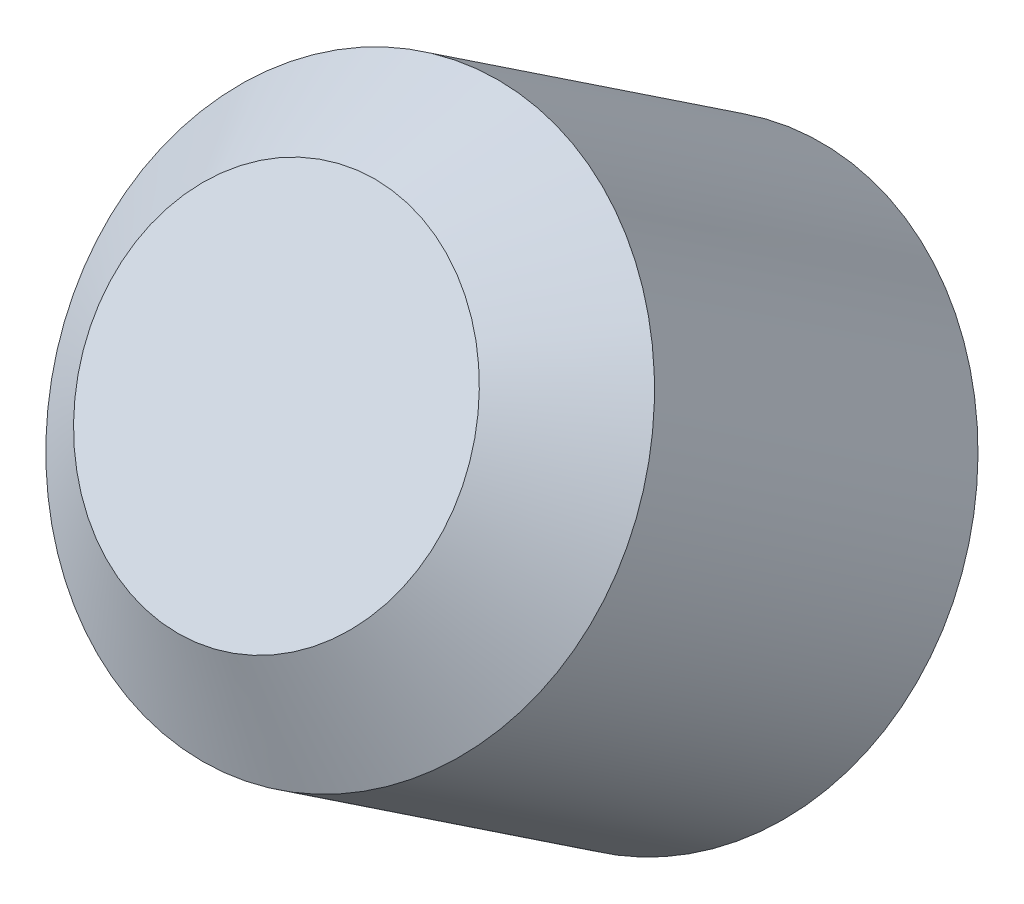
ISO-10303-21;
HEADER;
FILE_DESCRIPTION(('STEP AP214'),'2;1');
FILE_NAME('part.step','',(''),(''),'','','');
FILE_SCHEMA(('AUTOMOTIVE_DESIGN { 1 0 10303 214 1 1 1 1 }'));
ENDSEC;
DATA;
#1=APPLICATION_CONTEXT('core data for automotive mechanical design processes');
#2=APPLICATION_PROTOCOL_DEFINITION('international standard','automotive_design',2000,#1);
#3=PRODUCT_CONTEXT('',#1,'mechanical');
#4=PRODUCT('Part','Part','',(#3));
#5=PRODUCT_RELATED_PRODUCT_CATEGORY('part','',(#4));
#6=PRODUCT_DEFINITION_FORMATION('','',#4);
#7=PRODUCT_DEFINITION_CONTEXT('part definition',#1,'design');
#8=PRODUCT_DEFINITION('design','',#6,#7);
#9=PRODUCT_DEFINITION_SHAPE('','',#8);
#10=(LENGTH_UNIT() NAMED_UNIT(*) SI_UNIT(.MILLI.,.METRE.));
#11=(NAMED_UNIT(*) PLANE_ANGLE_UNIT() SI_UNIT($,.RADIAN.));
#12=(NAMED_UNIT(*) SI_UNIT($,.STERADIAN.) SOLID_ANGLE_UNIT());
#13=UNCERTAINTY_MEASURE_WITH_UNIT(LENGTH_MEASURE(1.E-05),#10,'distance_accuracy_value','');
#14=(GEOMETRIC_REPRESENTATION_CONTEXT(3) GLOBAL_UNCERTAINTY_ASSIGNED_CONTEXT((#13)) GLOBAL_UNIT_ASSIGNED_CONTEXT((#10,
#11,#12)) REPRESENTATION_CONTEXT('',''));
#15=CARTESIAN_POINT('',(0.,0.,0.));
#16=DIRECTION('',(0.,0.,1.));
#17=DIRECTION('',(1.,0.,0.));
#18=AXIS2_PLACEMENT_3D('',#15,#16,#17);
#19=CARTESIAN_POINT('',(0.,-2.38895200196565,-3.57531933287304));
#20=DIRECTION('',(0.,-0.555570233019603,-0.831469612302545));
#21=DIRECTION('',(0.,0.831469612302545,-0.555570233019603));
#22=AXIS2_PLACEMENT_3D('',#19,#20,#21);
#23=CONICAL_SURFACE('',#22,0.74999999988591,1.04719755105422);
#24=CARTESIAN_POINT('',(0.,-2.38895200199094,-3.57531933291089));
#25=DIRECTION('',(0.,-0.555570233019603,-0.831469612302545));
#26=DIRECTION('',(0.,0.831469612302545,-0.555570233019603));
#27=AXIS2_PLACEMENT_3D('',#24,#25,#26);
#28=CIRCLE('',#27,0.749999999964755);
#29=CARTESIAN_POINT('',(0.,-1.76534979277621,-3.99199700764673));
#30=VERTEX_POINT('',#29);
#31=CARTESIAN_POINT('',(-0.649519052823067,-2.07715089738149,-3.78365817028337));
#32=VERTEX_POINT('',#31);
#33=EDGE_CURVE('E141',#30,#32,#28,.F.);
#34=ORIENTED_EDGE('',*,*,#33,.F.);
#35=CARTESIAN_POINT('',(0.,-2.38895200199094,-3.57531933291089));
#36=DIRECTION('',(0.,-0.555570233019603,-0.831469612302545));
#37=DIRECTION('',(0.,0.831469612302545,-0.555570233019603));
#38=AXIS2_PLACEMENT_3D('',#35,#36,#37);
#39=CIRCLE('',#38,0.749999999964754);
#40=CARTESIAN_POINT('',(0.649519052823067,-2.07715089738149,-3.78365817028337));
#41=VERTEX_POINT('',#40);
#42=EDGE_CURVE('E144',#41,#30,#39,.F.);
#43=ORIENTED_EDGE('',*,*,#42,.F.);
#44=CARTESIAN_POINT('',(0.,-2.38895200199094,-3.57531933291089));
#45=DIRECTION('',(0.,-0.555570233019603,-0.831469612302545));
#46=DIRECTION('',(0.,0.831469612302545,-0.555570233019603));
#47=AXIS2_PLACEMENT_3D('',#44,#45,#46);
#48=CIRCLE('',#47,0.749999999964754);
#49=CARTESIAN_POINT('',(0.649519052823069,-2.70075310659374,-3.36698049552846));
#50=VERTEX_POINT('',#49);
#51=EDGE_CURVE('E94',#50,#41,#48,.F.);
#52=ORIENTED_EDGE('',*,*,#51,.F.);
#53=CARTESIAN_POINT('',(0.,-2.38895200199094,-3.57531933291089));
#54=DIRECTION('',(0.,-0.555570233019603,-0.831469612302545));
#55=DIRECTION('',(0.,0.831469612302545,-0.555570233019603));
#56=AXIS2_PLACEMENT_3D('',#53,#54,#55);
#57=CIRCLE('',#56,0.749999999964754);
#58=CARTESIAN_POINT('',(0.,-3.01255421114882,-3.15864165816794));
#59=VERTEX_POINT('',#58);
#60=EDGE_CURVE('E91',#59,#50,#57,.F.);
#61=ORIENTED_EDGE('',*,*,#60,.F.);
#62=CARTESIAN_POINT('',(0.,-2.38895200199094,-3.57531933291089));
#63=DIRECTION('',(0.,-0.555570233019603,-0.831469612302545));
#64=DIRECTION('',(0.,0.831469612302545,-0.555570233019603));
#65=AXIS2_PLACEMENT_3D('',#62,#63,#64);
#66=CIRCLE('',#65,0.749999999964754);
#67=CARTESIAN_POINT('',(-0.649519052823068,-2.70075310659374,-3.36698049552846));
#68=VERTEX_POINT('',#67);
#69=EDGE_CURVE('E20',#68,#59,#66,.F.);
#70=ORIENTED_EDGE('',*,*,#69,.F.);
#71=CARTESIAN_POINT('',(0.,-2.38895200199094,-3.57531933291089));
#72=DIRECTION('',(0.,-0.555570233019603,-0.831469612302545));
#73=DIRECTION('',(0.,0.831469612302545,-0.555570233019603));
#74=AXIS2_PLACEMENT_3D('',#71,#72,#73);
#75=CIRCLE('',#74,0.749999999964754);
#76=EDGE_CURVE('E139',#32,#68,#75,.F.);
#77=ORIENTED_EDGE('',*,*,#76,.F.);
#78=EDGE_LOOP('',(#34,#43,#52,#61,#70,#77));
#79=FACE_BOUND('',#78,.T.);
#80=CARTESIAN_POINT('',(0.,-2.1483830343243,-3.21528242950819));
#81=VERTEX_POINT('',#80);
#82=VERTEX_LOOP('',#81);
#83=FACE_BOUND('',#82,.T.);
#84=ADVANCED_FACE('F17',(#79,#83),#23,.F.);
#85=CARTESIAN_POINT('',(0.,-2.38895200198429,-3.57531933290094));
#86=DIRECTION('',(0.,-0.555570233019602,-0.831469612302545));
#87=DIRECTION('',(0.,0.831469612302545,-0.555570233019602));
#88=AXIS2_PLACEMENT_3D('',#85,#86,#87);
#89=PLANE('',#88);
#90=DIRECTION('',(1.,0.,0.));
#91=VECTOR('',#90,1.);
#92=CARTESIAN_POINT('',(0.433012701892219,-3.0125542112112,-3.15864165813624));
#93=LINE('',#92,#91);
#94=CARTESIAN_POINT('',(-0.433012701892219,-3.0125542112112,-3.15864165813624));
#95=VERTEX_POINT('',#94);
#96=EDGE_CURVE('E102',#59,#95,#93,.F.);
#97=ORIENTED_EDGE('',*,*,#96,.T.);
#98=DIRECTION('',(-0.499999999999999,0.720073806728807,-0.481137935381409));
#99=VECTOR('',#98,1.);
#100=CARTESIAN_POINT('',(-0.433012701892216,-3.0125542112112,-3.15864165813624));
#101=LINE('',#100,#99);
#102=EDGE_CURVE('E104',#95,#68,#101,.T.);
#103=ORIENTED_EDGE('',*,*,#102,.T.);
#104=ORIENTED_EDGE('',*,*,#69,.T.);
#105=EDGE_LOOP('',(#97,#103,#104));
#106=FACE_BOUND('',#105,.T.);
#107=ADVANCED_FACE('F100',(#106),#89,.T.);
#108=CARTESIAN_POINT('',(0.,-2.38895200198429,-3.57531933290094));
#109=DIRECTION('',(0.,-0.555570233019602,-0.831469612302545));
#110=DIRECTION('',(0.,0.831469612302545,-0.555570233019602));
#111=AXIS2_PLACEMENT_3D('',#108,#109,#110);
#112=PLANE('',#111);
#113=DIRECTION('',(-0.499999999999999,-0.720073806728807,0.48113793538141));
#114=VECTOR('',#113,1.);
#115=CARTESIAN_POINT('',(0.649519052838329,-2.70075310659774,-3.36698049551859));
#116=LINE('',#115,#114);
#117=CARTESIAN_POINT('',(0.433012701892218,-3.0125542112112,-3.15864165813624));
#118=VERTEX_POINT('',#117);
#119=EDGE_CURVE('E110',#50,#118,#116,.T.);
#120=ORIENTED_EDGE('',*,*,#119,.T.);
#121=DIRECTION('',(1.,0.,0.));
#122=VECTOR('',#121,1.);
#123=CARTESIAN_POINT('',(0.433012701892219,-3.0125542112112,-3.15864165813624));
#124=LINE('',#123,#122);
#125=EDGE_CURVE('E107',#118,#59,#124,.F.);
#126=ORIENTED_EDGE('',*,*,#125,.T.);
#127=ORIENTED_EDGE('',*,*,#60,.T.);
#128=EDGE_LOOP('',(#120,#126,#127));
#129=FACE_BOUND('',#128,.T.);
#130=ADVANCED_FACE('F108',(#129),#112,.T.);
#131=CARTESIAN_POINT('',(0.,-2.38895200198429,-3.57531933290094));
#132=DIRECTION('',(0.,-0.555570233019602,-0.831469612302545));
#133=DIRECTION('',(0.,0.831469612302545,-0.555570233019602));
#134=AXIS2_PLACEMENT_3D('',#131,#132,#133);
#135=PLANE('',#134);
#136=DIRECTION('',(0.5,-0.72007380672879,0.481137935381434));
#137=VECTOR('',#136,1.);
#138=CARTESIAN_POINT('',(0.64951905283833,-2.07715089737084,-3.7836581702833));
#139=LINE('',#138,#137);
#140=CARTESIAN_POINT('',(0.866025403784439,-2.38895200198429,-3.57531933290094));
#141=VERTEX_POINT('',#140);
#142=EDGE_CURVE('E151',#41,#141,#139,.T.);
#143=ORIENTED_EDGE('',*,*,#142,.T.);
#144=DIRECTION('',(-0.499999999999999,-0.720073806728801,0.481137935381418));
#145=VECTOR('',#144,1.);
#146=CARTESIAN_POINT('',(0.866025403784437,-2.38895200198429,-3.57531933290094));
#147=LINE('',#146,#145);
#148=EDGE_CURVE('E153',#141,#50,#147,.T.);
#149=ORIENTED_EDGE('',*,*,#148,.T.);
#150=ORIENTED_EDGE('',*,*,#51,.T.);
#151=EDGE_LOOP('',(#143,#149,#150));
#152=FACE_BOUND('',#151,.T.);
#153=ADVANCED_FACE('F149',(#152),#135,.T.);
#154=CARTESIAN_POINT('',(0.,-2.38895200198429,-3.57531933290094));
#155=DIRECTION('',(0.,-0.555570233019602,-0.831469612302545));
#156=DIRECTION('',(0.,0.831469612302545,-0.555570233019602));
#157=AXIS2_PLACEMENT_3D('',#154,#155,#156);
#158=PLANE('',#157);
#159=DIRECTION('',(1.,0.,0.));
#160=VECTOR('',#159,1.);
#161=CARTESIAN_POINT('',(-0.433012701892219,-1.76534979275738,-3.99199700766565));
#162=LINE('',#161,#160);
#163=CARTESIAN_POINT('',(0.433012701892219,-1.76534979275738,-3.99199700766565));
#164=VERTEX_POINT('',#163);
#165=EDGE_CURVE('E160',#30,#164,#162,.T.);
#166=ORIENTED_EDGE('',*,*,#165,.T.);
#167=DIRECTION('',(0.499999999999999,-0.720073806728807,0.481137935381409));
#168=VECTOR('',#167,1.);
#169=CARTESIAN_POINT('',(0.433012701892219,-1.76534979275738,-3.99199700766565));
#170=LINE('',#169,#168);
#171=EDGE_CURVE('E156',#164,#41,#170,.T.);
#172=ORIENTED_EDGE('',*,*,#171,.T.);
#173=ORIENTED_EDGE('',*,*,#42,.T.);
#174=EDGE_LOOP('',(#166,#172,#173));
#175=FACE_BOUND('',#174,.T.);
#176=ADVANCED_FACE('F157',(#175),#158,.T.);
#177=CARTESIAN_POINT('',(0.,-2.38895200198429,-3.57531933290094));
#178=DIRECTION('',(0.,-0.555570233019602,-0.831469612302545));
#179=DIRECTION('',(0.,0.831469612302545,-0.555570233019602));
#180=AXIS2_PLACEMENT_3D('',#177,#178,#179);
#181=PLANE('',#180);
#182=DIRECTION('',(0.499999999999999,0.720073806728808,-0.481137935381407));
#183=VECTOR('',#182,1.);
#184=CARTESIAN_POINT('',(-0.649519052838331,-2.07715089737084,-3.7836581702833));
#185=LINE('',#184,#183);
#186=CARTESIAN_POINT('',(-0.43301270189222,-1.76534979275738,-3.99199700766565));
#187=VERTEX_POINT('',#186);
#188=EDGE_CURVE('E209',#32,#187,#185,.T.);
#189=ORIENTED_EDGE('',*,*,#188,.T.);
#190=DIRECTION('',(1.,0.,0.));
#191=VECTOR('',#190,1.);
#192=CARTESIAN_POINT('',(-0.433012701892219,-1.76534979275738,-3.99199700766565));
#193=LINE('',#192,#191);
#194=EDGE_CURVE('E211',#187,#30,#193,.T.);
#195=ORIENTED_EDGE('',*,*,#194,.T.);
#196=ORIENTED_EDGE('',*,*,#33,.T.);
#197=EDGE_LOOP('',(#189,#195,#196));
#198=FACE_BOUND('',#197,.T.);
#199=ADVANCED_FACE('F255',(#198),#181,.T.);
#200=CARTESIAN_POINT('',(0.,-2.38895200198429,-3.57531933290094));
#201=DIRECTION('',(0.,-0.555570233019602,-0.831469612302545));
#202=DIRECTION('',(0.,0.831469612302545,-0.555570233019602));
#203=AXIS2_PLACEMENT_3D('',#200,#201,#202);
#204=PLANE('',#203);
#205=DIRECTION('',(-0.499999999999999,0.7200738067288,-0.481137935381419));
#206=VECTOR('',#205,1.);
#207=CARTESIAN_POINT('',(-0.649519052838327,-2.70075310659774,-3.36698049551859));
#208=LINE('',#207,#206);
#209=CARTESIAN_POINT('',(-0.866025403784439,-2.38895200198429,-3.57531933290094));
#210=VERTEX_POINT('',#209);
#211=EDGE_CURVE('E120',#68,#210,#208,.T.);
#212=ORIENTED_EDGE('',*,*,#211,.T.);
#213=DIRECTION('',(0.499999999999999,0.720073806728789,-0.481137935381436));
#214=VECTOR('',#213,1.);
#215=CARTESIAN_POINT('',(-0.866025403784441,-2.38895200198429,-3.57531933290094));
#216=LINE('',#215,#214);
#217=EDGE_CURVE('E203',#210,#32,#216,.T.);
#218=ORIENTED_EDGE('',*,*,#217,.T.);
#219=ORIENTED_EDGE('',*,*,#76,.T.);
#220=EDGE_LOOP('',(#212,#218,#219));
#221=FACE_BOUND('',#220,.T.);
#222=ADVANCED_FACE('F253',(#221),#204,.T.);
#223=CARTESIAN_POINT('',(-0.433012701892219,-3.67923849083472,-4.1564051928993));
#224=DIRECTION('',(-0.866025403784439,-0.415734806151272,0.277785116509801));
#225=DIRECTION('',(0.43276711903251,-0.901505751886421,0.));
#226=AXIS2_PLACEMENT_3D('',#223,#224,#225);
#227=PLANE('',#226);
#228=DIRECTION('',(0.,-0.555570233019602,-0.831469612302545));
#229=VECTOR('',#228,1.);
#230=CARTESIAN_POINT('',(-0.433012701892219,-3.67923849083472,-4.1564051928993));
#231=LINE('',#230,#229);
#232=CARTESIAN_POINT('',(-0.433012701892219,-3.67923849083472,-4.1564051928993));
#233=VERTEX_POINT('',#232);
#234=EDGE_CURVE('E113',#95,#233,#231,.T.);
#235=ORIENTED_EDGE('',*,*,#234,.T.);
#236=DIRECTION('',(0.500000000000001,-0.720073806728802,0.481137935381416));
#237=VECTOR('',#236,1.);
#238=CARTESIAN_POINT('',(-0.866025403784439,-3.05563628160781,-4.573082867664));
#239=LINE('',#238,#237);
#240=CARTESIAN_POINT('',(-0.866025403784439,-3.05563628160781,-4.573082867664));
#241=VERTEX_POINT('',#240);
#242=EDGE_CURVE('E201',#241,#233,#239,.T.);
#243=ORIENTED_EDGE('',*,*,#242,.F.);
#244=DIRECTION('',(0.,0.5555702330196,0.831469612302547));
#245=VECTOR('',#244,1.);
#246=CARTESIAN_POINT('',(-0.866025403784439,-3.05563628160781,-4.573082867664));
#247=LINE('',#246,#245);
#248=EDGE_CURVE('E216',#241,#210,#247,.T.);
#249=ORIENTED_EDGE('',*,*,#248,.T.);
#250=ORIENTED_EDGE('',*,*,#211,.F.);
#251=ORIENTED_EDGE('',*,*,#102,.F.);
#252=EDGE_LOOP('',(#235,#243,#249,#250,#251));
#253=FACE_BOUND('',#252,.T.);
#254=ADVANCED_FACE('F251',(#253),#227,.F.);
#255=CARTESIAN_POINT('',(0.433012701892219,-3.67923849083472,-4.1564051928993));
#256=DIRECTION('',(0.,-0.831469612302545,0.555570233019602));
#257=DIRECTION('',(0.,-0.555570233019602,-0.831469612302545));
#258=AXIS2_PLACEMENT_3D('',#255,#256,#257);
#259=PLANE('',#258);
#260=DIRECTION('',(0.,-0.555570233019599,-0.831469612302547));
#261=VECTOR('',#260,1.);
#262=CARTESIAN_POINT('',(0.433012701892218,-3.0125542112112,-3.15864165813624));
#263=LINE('',#262,#261);
#264=CARTESIAN_POINT('',(0.433012701892219,-3.67923849083472,-4.1564051928993));
#265=VERTEX_POINT('',#264);
#266=EDGE_CURVE('E170',#118,#265,#263,.T.);
#267=ORIENTED_EDGE('',*,*,#266,.T.);
#268=DIRECTION('',(1.,0.,0.));
#269=VECTOR('',#268,1.);
#270=CARTESIAN_POINT('',(0.,-3.67923849083472,-4.1564051928993));
#271=LINE('',#270,#269);
#272=EDGE_CURVE('E188',#233,#265,#271,.T.);
#273=ORIENTED_EDGE('',*,*,#272,.F.);
#274=ORIENTED_EDGE('',*,*,#234,.F.);
#275=ORIENTED_EDGE('',*,*,#96,.F.);
#276=ORIENTED_EDGE('',*,*,#125,.F.);
#277=EDGE_LOOP('',(#267,#273,#274,#275,#276));
#278=FACE_BOUND('',#277,.T.);
#279=ADVANCED_FACE('F116',(#278),#259,.F.);
#280=CARTESIAN_POINT('',(0.866025403784439,-3.05563628160781,-4.573082867664));
#281=DIRECTION('',(0.866025403784439,-0.415734806151272,0.277785116509801));
#282=DIRECTION('',(0.43276711903251,0.901505751886421,0.));
#283=AXIS2_PLACEMENT_3D('',#280,#281,#282);
#284=PLANE('',#283);
#285=DIRECTION('',(0.,-0.5555702330196,-0.831469612302547));
#286=VECTOR('',#285,1.);
#287=CARTESIAN_POINT('',(0.86602540378444,-2.38895200198429,-3.57531933290094));
#288=LINE('',#287,#286);
#289=CARTESIAN_POINT('',(0.866025403784439,-3.05563628160781,-4.573082867664));
#290=VERTEX_POINT('',#289);
#291=EDGE_CURVE('E163',#141,#290,#288,.T.);
#292=ORIENTED_EDGE('',*,*,#291,.T.);
#293=DIRECTION('',(0.500000000000001,0.720073806728802,-0.481137935381416));
#294=VECTOR('',#293,1.);
#295=CARTESIAN_POINT('',(0.433012701892219,-3.67923849083472,-4.1564051928993));
#296=LINE('',#295,#294);
#297=EDGE_CURVE('E192',#265,#290,#296,.T.);
#298=ORIENTED_EDGE('',*,*,#297,.F.);
#299=ORIENTED_EDGE('',*,*,#266,.F.);
#300=ORIENTED_EDGE('',*,*,#119,.F.);
#301=ORIENTED_EDGE('',*,*,#148,.F.);
#302=EDGE_LOOP('',(#292,#298,#299,#300,#301));
#303=FACE_BOUND('',#302,.T.);
#304=ADVANCED_FACE('F193',(#303),#284,.F.);
#305=CARTESIAN_POINT('',(0.433012701892219,-2.4320340723809,-4.9897605424287));
#306=DIRECTION('',(0.866025403784439,0.415734806151272,-0.277785116509801));
#307=DIRECTION('',(-0.43276711903251,0.901505751886421,0.));
#308=AXIS2_PLACEMENT_3D('',#305,#306,#307);
#309=PLANE('',#308);
#310=DIRECTION('',(0.,0.555570233019602,0.831469612302545));
#311=VECTOR('',#310,1.);
#312=CARTESIAN_POINT('',(0.433012701892219,-2.4320340723809,-4.9897605424287));
#313=LINE('',#312,#311);
#314=CARTESIAN_POINT('',(0.433012701892219,-2.4320340723809,-4.9897605424287));
#315=VERTEX_POINT('',#314);
#316=EDGE_CURVE('E233',#164,#315,#313,.F.);
#317=ORIENTED_EDGE('',*,*,#316,.T.);
#318=DIRECTION('',(-0.500000000000001,0.720073806728802,-0.481137935381415));
#319=VECTOR('',#318,1.);
#320=CARTESIAN_POINT('',(0.866025403784439,-3.05563628160781,-4.573082867664));
#321=LINE('',#320,#319);
#322=EDGE_CURVE('E196',#290,#315,#321,.T.);
#323=ORIENTED_EDGE('',*,*,#322,.F.);
#324=ORIENTED_EDGE('',*,*,#291,.F.);
#325=ORIENTED_EDGE('',*,*,#142,.F.);
#326=ORIENTED_EDGE('',*,*,#171,.F.);
#327=EDGE_LOOP('',(#317,#323,#324,#325,#326));
#328=FACE_BOUND('',#327,.T.);
#329=ADVANCED_FACE('F166',(#328),#309,.F.);
#330=CARTESIAN_POINT('',(-0.433012701892219,-2.4320340723809,-4.9897605424287));
#331=DIRECTION('',(0.,0.831469612302545,-0.555570233019602));
#332=DIRECTION('',(0.,0.555570233019602,0.831469612302545));
#333=AXIS2_PLACEMENT_3D('',#330,#331,#332);
#334=PLANE('',#333);
#335=DIRECTION('',(0.,-0.555570233019603,-0.831469612302545));
#336=VECTOR('',#335,1.);
#337=CARTESIAN_POINT('',(-0.43301270189222,-1.76534979275738,-3.99199700766565));
#338=LINE('',#337,#336);
#339=CARTESIAN_POINT('',(-0.433012701892219,-2.4320340723809,-4.9897605424287));
#340=VERTEX_POINT('',#339);
#341=EDGE_CURVE('E35',#187,#340,#338,.T.);
#342=ORIENTED_EDGE('',*,*,#341,.T.);
#343=DIRECTION('',(1.,0.,0.));
#344=VECTOR('',#343,1.);
#345=CARTESIAN_POINT('',(0.,-2.4320340723809,-4.9897605424287));
#346=LINE('',#345,#344);
#347=EDGE_CURVE('E229',#315,#340,#346,.F.);
#348=ORIENTED_EDGE('',*,*,#347,.F.);
#349=ORIENTED_EDGE('',*,*,#316,.F.);
#350=ORIENTED_EDGE('',*,*,#165,.F.);
#351=ORIENTED_EDGE('',*,*,#194,.F.);
#352=EDGE_LOOP('',(#342,#348,#349,#350,#351));
#353=FACE_BOUND('',#352,.T.);
#354=ADVANCED_FACE('F243',(#353),#334,.F.);
#355=CARTESIAN_POINT('',(-0.866025403784439,-3.05563628160781,-4.573082867664));
#356=DIRECTION('',(-0.866025403784439,0.415734806151272,-0.277785116509801));
#357=DIRECTION('',(-0.43276711903251,-0.901505751886421,0.));
#358=AXIS2_PLACEMENT_3D('',#355,#356,#357);
#359=PLANE('',#358);
#360=ORIENTED_EDGE('',*,*,#248,.F.);
#361=DIRECTION('',(-0.500000000000001,-0.720073806728802,0.481137935381415));
#362=VECTOR('',#361,1.);
#363=CARTESIAN_POINT('',(-0.433012701892219,-2.4320340723809,-4.9897605424287));
#364=LINE('',#363,#362);
#365=EDGE_CURVE('E138',#340,#241,#364,.T.);
#366=ORIENTED_EDGE('',*,*,#365,.F.);
#367=ORIENTED_EDGE('',*,*,#341,.F.);
#368=ORIENTED_EDGE('',*,*,#188,.F.);
#369=ORIENTED_EDGE('',*,*,#217,.F.);
#370=EDGE_LOOP('',(#360,#366,#367,#368,#369));
#371=FACE_BOUND('',#370,.T.);
#372=ADVANCED_FACE('F247',(#371),#359,.F.);
#373=CARTESIAN_POINT('',(0.,-2.55945679046627,-4.90461940421845));
#374=DIRECTION('',(0.,-0.555570233019602,-0.831469612302545));
#375=DIRECTION('',(0.,0.831469612302545,-0.555570233019602));
#376=AXIS2_PLACEMENT_3D('',#373,#374,#375);
#377=PLANE('',#376);
#378=CARTESIAN_POINT('',(0.,-3.05563628158638,-4.57308286763192));
#379=DIRECTION('',(0.,0.555570233019602,0.831469612302545));
#380=DIRECTION('',(0.,-0.831469612302545,0.555570233019602));
#381=AXIS2_PLACEMENT_3D('',#378,#379,#380);
#382=CIRCLE('',#381,1.19350000002576);
#383=CARTESIAN_POINT('',(0.,-4.04799526389089,-3.91000979450871));
#384=VERTEX_POINT('',#383);
#385=EDGE_CURVE('E135',#384,#384,#382,.T.);
#386=ORIENTED_EDGE('',*,*,#385,.F.);
#387=EDGE_LOOP('',(#386));
#388=FACE_BOUND('',#387,.T.);
#389=ORIENTED_EDGE('',*,*,#347,.T.);
#390=ORIENTED_EDGE('',*,*,#365,.T.);
#391=ORIENTED_EDGE('',*,*,#242,.T.);
#392=ORIENTED_EDGE('',*,*,#272,.T.);
#393=ORIENTED_EDGE('',*,*,#297,.T.);
#394=ORIENTED_EDGE('',*,*,#322,.T.);
#395=EDGE_LOOP('',(#389,#390,#391,#392,#393,#394));
#396=FACE_BOUND('',#395,.T.);
#397=ADVANCED_FACE('F199',(#388,#396),#377,.T.);
#398=CARTESIAN_POINT('',(0.,-0.973190776397733,-2.35645914726616));
#399=DIRECTION('',(0.,0.555570233019602,0.831469612302545));
#400=DIRECTION('',(0.,-0.831469612302545,0.555570233019602));
#401=AXIS2_PLACEMENT_3D('',#398,#399,#400);
#402=PLANE('',#401);
#403=CARTESIAN_POINT('',(0.,-1.38892558256313,-2.0786740307775));
#404=DIRECTION('',(0.,-0.555570233019602,-0.831469612302545));
#405=DIRECTION('',(0.,0.831469612302545,-0.555570233019602));
#406=AXIS2_PLACEMENT_3D('',#403,#404,#405);
#407=CIRCLE('',#406,1.00000000000578);
#408=CARTESIAN_POINT('',(0.,-0.557455970255787,-2.63424426380031));
#409=VERTEX_POINT('',#408);
#410=EDGE_CURVE('E132',#409,#409,#407,.T.);
#411=ORIENTED_EDGE('',*,*,#410,.F.);
#412=EDGE_LOOP('',(#411));
#413=FACE_BOUND('',#412,.T.);
#414=ADVANCED_FACE('F280',(#413),#402,.T.);
#415=CARTESIAN_POINT('',(0.,-2.88535400524421,-4.31823743157842));
#416=DIRECTION('',(0.,0.555570233019602,0.831469612302545));
#417=DIRECTION('',(0.,-0.831469612302545,0.555570233019602));
#418=AXIS2_PLACEMENT_3D('',#415,#416,#417);
#419=CONICAL_SURFACE('',#418,1.4999999998906,0.785398163406957);
#420=ORIENTED_EDGE('',*,*,#385,.T.);
#421=EDGE_LOOP('',(#420));
#422=FACE_BOUND('',#421,.T.);
#423=CARTESIAN_POINT('',(0.,-2.88535400518731,-4.31823743149327));
#424=DIRECTION('',(0.,0.555570233019602,0.831469612302545));
#425=DIRECTION('',(0.,-0.831469612302545,0.555570233019602));
#426=AXIS2_PLACEMENT_3D('',#423,#424,#425);
#427=CIRCLE('',#426,1.5);
#428=CARTESIAN_POINT('',(0.,-4.13255842364113,-3.48488208196386));
#429=VERTEX_POINT('',#428);
#430=EDGE_CURVE('E26',#429,#429,#427,.T.);
#431=ORIENTED_EDGE('',*,*,#430,.F.);
#432=EDGE_LOOP('',(#431));
#433=FACE_BOUND('',#432,.T.);
#434=ADVANCED_FACE('F273',(#422,#433),#419,.T.);
#435=CARTESIAN_POINT('',(0.,-1.66671069904883,-2.49440883689269));
#436=DIRECTION('',(0.,-0.555570233019602,-0.831469612302545));
#437=DIRECTION('',(0.,0.831469612302545,-0.555570233019602));
#438=AXIS2_PLACEMENT_3D('',#435,#436,#437);
#439=CONICAL_SURFACE('',#438,1.49999999995067,0.785398163385734);
#440=ORIENTED_EDGE('',*,*,#410,.T.);
#441=EDGE_LOOP('',(#440));
#442=FACE_BOUND('',#441,.T.);
#443=CARTESIAN_POINT('',(0.,-1.66671069905881,-2.49440883690763));
#444=DIRECTION('',(0.,0.555570233019602,0.831469612302545));
#445=DIRECTION('',(0.,-0.831469612302545,0.555570233019602));
#446=AXIS2_PLACEMENT_3D('',#443,#444,#445);
#447=CIRCLE('',#446,1.5);
#448=CARTESIAN_POINT('',(0.,-2.91391511751263,-1.66105348737823));
#449=VERTEX_POINT('',#448);
#450=EDGE_CURVE('E11',#449,#449,#447,.F.);
#451=ORIENTED_EDGE('',*,*,#450,.F.);
#452=EDGE_LOOP('',(#451));
#453=FACE_BOUND('',#452,.T.);
#454=ADVANCED_FACE('F267',(#442,#453),#439,.T.);
#455=CARTESIAN_POINT('',(0.,-2.27603235212306,-3.40632313420045));
#456=DIRECTION('',(0.,0.555570233019602,0.831469612302545));
#457=DIRECTION('',(0.,-0.831469612302545,0.555570233019602));
#458=AXIS2_PLACEMENT_3D('',#455,#456,#457);
#459=CYLINDRICAL_SURFACE('',#458,1.5);
#460=ORIENTED_EDGE('',*,*,#430,.T.);
#461=EDGE_LOOP('',(#460));
#462=FACE_BOUND('',#461,.T.);
#463=ORIENTED_EDGE('',*,*,#450,.T.);
#464=EDGE_LOOP('',(#463));
#465=FACE_BOUND('',#464,.T.);
#466=ADVANCED_FACE('F265',(#462,#465),#459,.T.);
#467=CLOSED_SHELL('',(#84,#107,#130,#153,#176,#199,#222,#254,#279,#304,#329,#354,#372,#397,#414,
#434,#454,#466));
#468=MANIFOLD_SOLID_BREP('B1',#467);
#469=ADVANCED_BREP_SHAPE_REPRESENTATION('',(#18,#468),#14);
#470=SHAPE_DEFINITION_REPRESENTATION(#9,#469);
ENDSEC;
END-ISO-10303-21;
